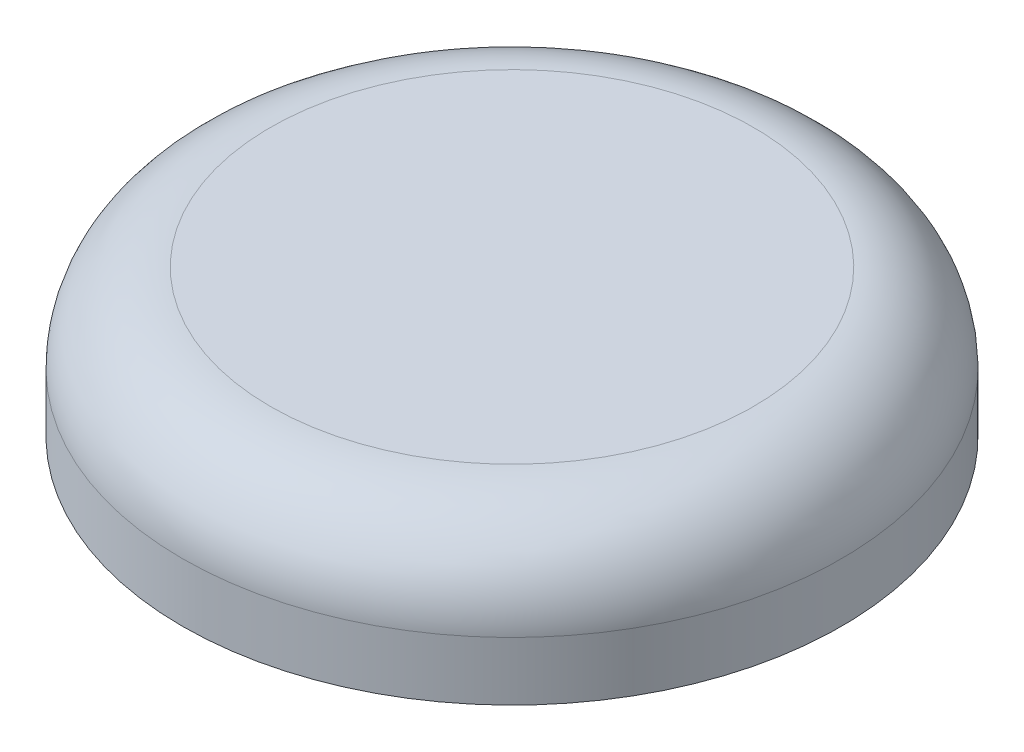
ISO-10303-21;
HEADER;
FILE_DESCRIPTION(('STEP AP214'),'2;1');
FILE_NAME('part.step','',(''),(''),'','','');
FILE_SCHEMA(('AUTOMOTIVE_DESIGN { 1 0 10303 214 1 1 1 1 }'));
ENDSEC;
DATA;
#1=APPLICATION_CONTEXT('core data for automotive mechanical design processes');
#2=APPLICATION_PROTOCOL_DEFINITION('international standard','automotive_design',2000,#1);
#3=PRODUCT_CONTEXT('',#1,'mechanical');
#4=PRODUCT('Part','Part','',(#3));
#5=PRODUCT_RELATED_PRODUCT_CATEGORY('part','',(#4));
#6=PRODUCT_DEFINITION_FORMATION('','',#4);
#7=PRODUCT_DEFINITION_CONTEXT('part definition',#1,'design');
#8=PRODUCT_DEFINITION('design','',#6,#7);
#9=PRODUCT_DEFINITION_SHAPE('','',#8);
#10=(LENGTH_UNIT() NAMED_UNIT(*) SI_UNIT(.MILLI.,.METRE.));
#11=(NAMED_UNIT(*) PLANE_ANGLE_UNIT() SI_UNIT($,.RADIAN.));
#12=(NAMED_UNIT(*) SI_UNIT($,.STERADIAN.) SOLID_ANGLE_UNIT());
#13=UNCERTAINTY_MEASURE_WITH_UNIT(LENGTH_MEASURE(1.E-05),#10,'distance_accuracy_value','');
#14=(GEOMETRIC_REPRESENTATION_CONTEXT(3) GLOBAL_UNCERTAINTY_ASSIGNED_CONTEXT((#13)) GLOBAL_UNIT_ASSIGNED_CONTEXT((#10,
#11,#12)) REPRESENTATION_CONTEXT('',''));
#15=CARTESIAN_POINT('',(0.,0.,0.));
#16=DIRECTION('',(0.,0.,1.));
#17=DIRECTION('',(1.,0.,0.));
#18=AXIS2_PLACEMENT_3D('',#15,#16,#17);
#19=CARTESIAN_POINT('',(0.,5.,0.));
#20=DIRECTION('',(0.,-1.,0.));
#21=DIRECTION('',(0.,0.,-1.));
#22=AXIS2_PLACEMENT_3D('',#19,#20,#21);
#23=CYLINDRICAL_SURFACE('',#22,11.25);
#24=CARTESIAN_POINT('',(0.,2.,0.));
#25=DIRECTION('',(0.,1.,0.));
#26=DIRECTION('',(0.,0.,1.));
#27=AXIS2_PLACEMENT_3D('',#24,#25,#26);
#28=CIRCLE('',#27,11.25);
#29=CARTESIAN_POINT('',(0.,2.,11.25));
#30=VERTEX_POINT('',#29);
#31=EDGE_CURVE('E10',#30,#30,#28,.F.);
#32=ORIENTED_EDGE('',*,*,#31,.T.);
#33=EDGE_LOOP('',(#32));
#34=FACE_BOUND('',#33,.T.);
#35=CARTESIAN_POINT('',(0.,0.,0.));
#36=DIRECTION('',(0.,1.,0.));
#37=DIRECTION('',(0.,0.,1.));
#38=AXIS2_PLACEMENT_3D('',#35,#36,#37);
#39=CIRCLE('',#38,11.25);
#40=CARTESIAN_POINT('',(0.,0.,11.25));
#41=VERTEX_POINT('',#40);
#42=EDGE_CURVE('E42',#41,#41,#39,.T.);
#43=ORIENTED_EDGE('',*,*,#42,.T.);
#44=EDGE_LOOP('',(#43));
#45=FACE_BOUND('',#44,.T.);
#46=ADVANCED_FACE('F31',(#34,#45),#23,.T.);
#47=CARTESIAN_POINT('',(0.,5.,0.));
#48=DIRECTION('',(0.,1.,0.));
#49=DIRECTION('',(0.,0.,1.));
#50=AXIS2_PLACEMENT_3D('',#47,#48,#49);
#51=PLANE('',#50);
#52=CARTESIAN_POINT('',(0.,5.,0.));
#53=DIRECTION('',(0.,1.,0.));
#54=DIRECTION('',(0.,0.,1.));
#55=AXIS2_PLACEMENT_3D('',#52,#53,#54);
#56=CIRCLE('',#55,8.25);
#57=CARTESIAN_POINT('',(0.,5.,8.25));
#58=VERTEX_POINT('',#57);
#59=EDGE_CURVE('E38',#58,#58,#56,.T.);
#60=ORIENTED_EDGE('',*,*,#59,.T.);
#61=EDGE_LOOP('',(#60));
#62=FACE_BOUND('',#61,.T.);
#63=ADVANCED_FACE('F52',(#62),#51,.T.);
#64=CARTESIAN_POINT('',(0.,0.,0.));
#65=DIRECTION('',(0.,1.,0.));
#66=DIRECTION('',(0.,0.,1.));
#67=AXIS2_PLACEMENT_3D('',#64,#65,#66);
#68=PLANE('',#67);
#69=ORIENTED_EDGE('',*,*,#42,.F.);
#70=EDGE_LOOP('',(#69));
#71=FACE_BOUND('',#70,.T.);
#72=ADVANCED_FACE('F50',(#71),#68,.F.);
#73=CARTESIAN_POINT('',(0.,2.,0.));
#74=DIRECTION('',(0.,1.,0.));
#75=DIRECTION('',(0.,0.,1.));
#76=AXIS2_PLACEMENT_3D('',#73,#74,#75);
#77=TOROIDAL_SURFACE('',#76,8.25,3.);
#78=ORIENTED_EDGE('',*,*,#31,.F.);
#79=EDGE_LOOP('',(#78));
#80=FACE_BOUND('',#79,.T.);
#81=ORIENTED_EDGE('',*,*,#59,.F.);
#82=EDGE_LOOP('',(#81));
#83=FACE_BOUND('',#82,.T.);
#84=ADVANCED_FACE('F33',(#80,#83),#77,.T.);
#85=CLOSED_SHELL('',(#46,#63,#72,#84));
#86=MANIFOLD_SOLID_BREP('B2',#85);
#87=ADVANCED_BREP_SHAPE_REPRESENTATION('',(#18,#86),#14);
#88=SHAPE_DEFINITION_REPRESENTATION(#9,#87);
ENDSEC;
END-ISO-10303-21;
